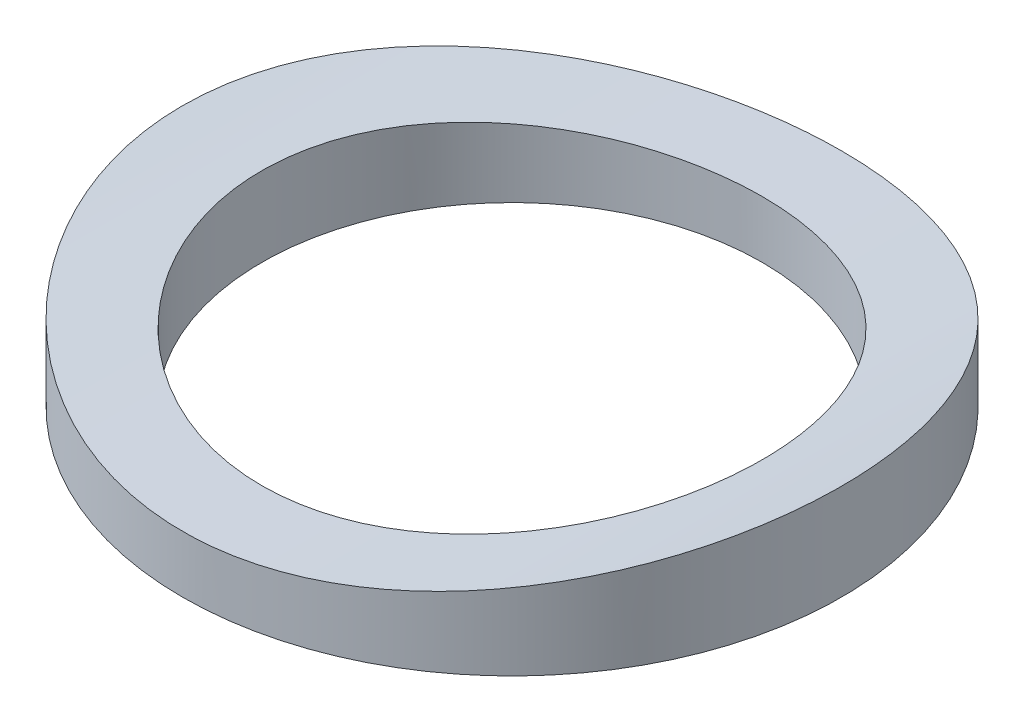
ISO-10303-21;
HEADER;
FILE_DESCRIPTION(('STEP AP214'),'2;1');
FILE_NAME('part.step','',(''),(''),'','','');
FILE_SCHEMA(('AUTOMOTIVE_DESIGN { 1 0 10303 214 1 1 1 1 }'));
ENDSEC;
DATA;
#1=APPLICATION_CONTEXT('core data for automotive mechanical design processes');
#2=APPLICATION_PROTOCOL_DEFINITION('international standard','automotive_design',2000,#1);
#3=PRODUCT_CONTEXT('',#1,'mechanical');
#4=PRODUCT('Part','Part','',(#3));
#5=PRODUCT_RELATED_PRODUCT_CATEGORY('part','',(#4));
#6=PRODUCT_DEFINITION_FORMATION('','',#4);
#7=PRODUCT_DEFINITION_CONTEXT('part definition',#1,'design');
#8=PRODUCT_DEFINITION('design','',#6,#7);
#9=PRODUCT_DEFINITION_SHAPE('','',#8);
#10=(LENGTH_UNIT() NAMED_UNIT(*) SI_UNIT(.MILLI.,.METRE.));
#11=(NAMED_UNIT(*) PLANE_ANGLE_UNIT() SI_UNIT($,.RADIAN.));
#12=(NAMED_UNIT(*) SI_UNIT($,.STERADIAN.) SOLID_ANGLE_UNIT());
#13=UNCERTAINTY_MEASURE_WITH_UNIT(LENGTH_MEASURE(1.E-05),#10,'distance_accuracy_value','');
#14=(GEOMETRIC_REPRESENTATION_CONTEXT(3) GLOBAL_UNCERTAINTY_ASSIGNED_CONTEXT((#13)) GLOBAL_UNIT_ASSIGNED_CONTEXT((#10,
#11,#12)) REPRESENTATION_CONTEXT('',''));
#15=CARTESIAN_POINT('',(0.,0.,0.));
#16=DIRECTION('',(0.,0.,1.));
#17=DIRECTION('',(1.,0.,0.));
#18=AXIS2_PLACEMENT_3D('',#15,#16,#17);
#19=CARTESIAN_POINT('',(0.,0.,0.));
#20=DIRECTION('',(0.,1.,0.));
#21=DIRECTION('',(0.,0.,1.));
#22=AXIS2_PLACEMENT_3D('',#19,#20,#21);
#23=PLANE('',#22);
#24=CARTESIAN_POINT('',(0.,0.,0.));
#25=DIRECTION('',(0.,1.,0.));
#26=DIRECTION('',(0.,0.,1.));
#27=AXIS2_PLACEMENT_3D('',#24,#25,#26);
#28=CIRCLE('',#27,10.4);
#29=CARTESIAN_POINT('',(0.,0.,10.4));
#30=VERTEX_POINT('',#29);
#31=EDGE_CURVE('E82',#30,#30,#28,.T.);
#32=ORIENTED_EDGE('',*,*,#31,.F.);
#33=EDGE_LOOP('',(#32));
#34=FACE_BOUND('',#33,.T.);
#35=CARTESIAN_POINT('',(0.,0.,0.));
#36=DIRECTION('',(0.,1.,0.));
#37=DIRECTION('',(0.,0.,1.));
#38=AXIS2_PLACEMENT_3D('',#35,#36,#37);
#39=CIRCLE('',#38,7.9);
#40=CARTESIAN_POINT('',(0.,0.,7.9));
#41=VERTEX_POINT('',#40);
#42=EDGE_CURVE('E86',#41,#41,#39,.T.);
#43=ORIENTED_EDGE('',*,*,#42,.T.);
#44=EDGE_LOOP('',(#43));
#45=FACE_BOUND('',#44,.T.);
#46=ADVANCED_FACE('F70',(#34,#45),#23,.F.);
#47=CARTESIAN_POINT('',(0.,3.2,0.));
#48=DIRECTION('',(0.,-1.,0.));
#49=DIRECTION('',(0.,0.,-1.));
#50=AXIS2_PLACEMENT_3D('',#47,#48,#49);
#51=CYLINDRICAL_SURFACE('',#50,10.4);
#52=CARTESIAN_POINT('',(0.,1.79999999999999,-10.4));
#53=CARTESIAN_POINT('',(0.287979332366271,1.79999565918138,-10.4000075384142));
#54=CARTESIAN_POINT('',(0.575872328720131,1.80280301075427,-10.3880363887862));
#55=CARTESIAN_POINT('',(1.14965018998951,1.81394450596868,-10.3402672567559));
#56=CARTESIAN_POINT('',(1.43553478254078,1.82227938512812,-10.3044661034227));
#57=CARTESIAN_POINT('',(2.0032952509663,1.84425592871867,-10.2092963026971));
#58=CARTESIAN_POINT('',(2.28516881630307,1.85790053295831,-10.149914599208));
#59=CARTESIAN_POINT('',(2.842765148361,1.89011755533941,-10.0080687635648));
#60=CARTESIAN_POINT('',(3.11848778082583,1.90869008092869,-9.92560412811102));
#61=CARTESIAN_POINT('',(3.66154120237418,1.95022910967917,-9.73835292754523));
#62=CARTESIAN_POINT('',(3.92888131867466,1.97319051161332,-9.63359226140965));
#63=CARTESIAN_POINT('',(4.45369682247072,2.02289780247291,-9.40248884021462));
#64=CARTESIAN_POINT('',(4.71117214482182,2.04964371638479,-9.27614594266192));
#65=CARTESIAN_POINT('',(5.21450899153123,2.10619488065719,-9.00282705863755));
#66=CARTESIAN_POINT('',(5.46037267742171,2.13599955831815,-8.8558549327372));
#67=CARTESIAN_POINT('',(5.93902647037211,2.19788620789578,-8.54223976409452));
#68=CARTESIAN_POINT('',(6.17181222101069,2.22996893069466,-8.37559022323182));
#69=CARTESIAN_POINT('',(6.62638723058722,2.29607978467334,-8.02093721842671));
#70=CARTESIAN_POINT('',(6.84793773282754,2.3301309882547,-7.83263196870272));
#71=CARTESIAN_POINT('',(7.27446060948033,2.39875835983832,-7.438185463944));
#72=CARTESIAN_POINT('',(7.47943281712706,2.43333453311725,-7.23204402953321));
#73=CARTESIAN_POINT('',(7.87149523559683,2.50206640972871,-6.80323323619052));
#74=CARTESIAN_POINT('',(8.05858054504711,2.53622199559074,-6.58055937656572));
#75=CARTESIAN_POINT('',(8.41347876906059,2.60313891588837,-6.12027768098893));
#76=CARTESIAN_POINT('',(8.58129839316741,2.63590073320605,-5.88267508905527));
#77=CARTESIAN_POINT('',(8.89862926609753,2.6995300099637,-5.39084003680556));
#78=CARTESIAN_POINT('',(9.04787338934574,2.73036721451727,-5.13643119523148));
#79=CARTESIAN_POINT('',(9.32435395548388,2.78876556520445,-4.61555641703929));
#80=CARTESIAN_POINT('',(9.45159015775254,2.81632667551821,-4.34909034863496));
#81=CARTESIAN_POINT('',(9.68305329513035,2.8673417967741,-3.805995177128));
#82=CARTESIAN_POINT('',(9.78728270501069,2.89079624940083,-3.52936717085185));
#83=CARTESIAN_POINT('',(9.97190217097707,2.93288280283842,-2.967910184837));
#84=CARTESIAN_POINT('',(10.0522927225158,2.95151500387107,-2.68308137567392));
#85=CARTESIAN_POINT('',(10.187352858044,2.98309498275912,-2.11241381013649));
#86=CARTESIAN_POINT('',(10.2424520787315,2.99613744121785,-1.82668195114166));
#87=CARTESIAN_POINT('',(10.3285314067545,3.01661125292242,-1.25140811250909));
#88=CARTESIAN_POINT('',(10.3595117716163,3.02404266607954,-0.961866173586625));
#89=CARTESIAN_POINT('',(10.3970850023576,3.03306468008669,-0.381149226085959));
#90=CARTESIAN_POINT('',(10.4036808840413,3.03465600322243,-0.0899744239171189));
#91=CARTESIAN_POINT('',(10.3924359926692,3.03195043355339,0.491873478725045));
#92=CARTESIAN_POINT('',(10.3745955111182,3.02765361098915,0.782546585141755));
#93=CARTESIAN_POINT('',(10.3152659146458,3.01345653384808,1.35513241263597));
#94=CARTESIAN_POINT('',(10.2742827259317,3.00367618696533,1.63710071085482));
#95=CARTESIAN_POINT('',(10.1693840755349,2.97888922489355,2.19649912619758));
#96=CARTESIAN_POINT('',(10.1054689841644,2.96388269409882,2.47392931652874));
#97=CARTESIAN_POINT('',(9.95521196810511,2.92907902534009,3.02234940016677));
#98=CARTESIAN_POINT('',(9.86886906963075,2.90928167936781,3.29333901327457));
#99=CARTESIAN_POINT('',(9.67442089262355,2.86546353603769,3.82704141556052));
#100=CARTESIAN_POINT('',(9.56631531115719,2.84144267988976,4.08975408946596));
#101=CARTESIAN_POINT('',(9.32809817362227,2.78962651025365,4.60743771486977));
#102=CARTESIAN_POINT('',(9.19780172905885,2.76179990713803,4.86232043597072));
#103=CARTESIAN_POINT('',(8.9167612256678,2.70330703863284,5.36033132237882));
#104=CARTESIAN_POINT('',(8.76600957068297,2.67263971967644,5.6034550752145));
#105=CARTESIAN_POINT('',(8.44518124145602,2.60932939812987,6.07622432254691));
#106=CARTESIAN_POINT('',(8.27510990784106,2.57668694269614,6.30587351538628));
#107=CARTESIAN_POINT('',(7.91666091796957,2.51029024305204,6.75041070118731));
#108=CARTESIAN_POINT('',(7.72827489842882,2.47653549561561,6.96529187325198));
#109=CARTESIAN_POINT('',(7.32957745168367,2.4079915176292,7.38396360933965));
#110=CARTESIAN_POINT('',(7.11883708306034,2.37319744643294,7.58734513608684));
#111=CARTESIAN_POINT('',(6.68098557800986,2.30439712907763,7.97558821653348));
#112=CARTESIAN_POINT('',(6.45388164777477,2.27039054473822,8.16045783783007));
#113=CARTESIAN_POINT('',(5.98462539066921,2.20408166514832,8.51058120208903));
#114=CARTESIAN_POINT('',(5.74246630522204,2.1717801475465,8.67582603677351));
#115=CARTESIAN_POINT('',(5.24491510623755,2.10981219430386,8.98535879701328));
#116=CARTESIAN_POINT('',(4.98952821554584,2.08014473100747,9.12965490962754));
#117=CARTESIAN_POINT('',(4.46640785389844,2.02418075053374,9.39668508976085));
#118=CARTESIAN_POINT('',(4.19864041013301,1.99789436158858,9.51935476278368));
#119=CARTESIAN_POINT('',(3.65333258769069,1.94954203892195,9.7416555960068));
#120=CARTESIAN_POINT('',(3.37579216309786,1.92747612503247,9.84128664794915));
#121=CARTESIAN_POINT('',(2.81297411548941,1.88820072806907,10.016688373507));
#122=CARTESIAN_POINT('',(2.52769754971066,1.87099058502523,10.0924622898168));
#123=CARTESIAN_POINT('',(1.9514765467999,1.84192139304554,10.21952922784));
#124=CARTESIAN_POINT('',(1.66053223119824,1.83006222950312,10.2708227738721));
#125=CARTESIAN_POINT('',(1.08177863165197,1.81224381753214,10.3476101312934));
#126=CARTESIAN_POINT('',(0.794047013382103,1.80615733391819,10.3736606178919));
#127=CARTESIAN_POINT('',(0.217351824480446,1.79959610090213,10.4017352240859));
#128=CARTESIAN_POINT('',(-0.0716117275509139,1.79912126707022,10.4037597051634));
#129=CARTESIAN_POINT('',(-0.648637889421152,1.80379643834373,10.3837663739423));
#130=CARTESIAN_POINT('',(-0.9367005629932,1.80894603608476,10.3617503028445));
#131=CARTESIAN_POINT('',(-1.5098477536148,1.82472512484065,10.2938639783747));
#132=CARTESIAN_POINT('',(-1.79493228011832,1.83535459845455,10.2479938007497));
#133=CARTESIAN_POINT('',(-2.35645381349374,1.86162739932664,10.1335176004614));
#134=CARTESIAN_POINT('',(-2.63295477941222,1.87720488954771,10.0652097418747));
#135=CARTESIAN_POINT('',(-3.17914635317738,1.91299023847337,9.90625691494718));
#136=CARTESIAN_POINT('',(-3.44883703702728,1.93319804547794,9.81561219600878));
#137=CARTESIAN_POINT('',(-3.97956426545497,1.97770073920218,9.6126881437295));
#138=CARTESIAN_POINT('',(-4.24060178955871,2.0019951614183,9.50041126898872));
#139=CARTESIAN_POINT('',(-4.75243738377748,2.05403813397539,9.25499452349283));
#140=CARTESIAN_POINT('',(-5.00323151261985,2.08178799751963,9.12184671595849));
#141=CARTESIAN_POINT('',(-5.49667386340075,2.14045714896825,8.83343124076315));
#142=CARTESIAN_POINT('',(-5.73913486844614,2.17141899774873,8.67785191143518));
#143=CARTESIAN_POINT('',(-6.21025578350327,2.23532324054324,8.34719032247744));
#144=CARTESIAN_POINT('',(-6.43890939809275,2.26826652452318,8.17209926854852));
#145=CARTESIAN_POINT('',(-6.88085386205831,2.33523805753134,7.80362940638776));
#146=CARTESIAN_POINT('',(-7.0941426741768,2.36926644957697,7.61024818084998));
#147=CARTESIAN_POINT('',(-7.5038581173647,2.43747056580088,7.20657917536616));
#148=CARTESIAN_POINT('',(-7.7002920213352,2.47164621968177,6.99629876405626));
#149=CARTESIAN_POINT('',(-8.0791997536158,2.53996794023571,6.5553682278538));
#150=CARTESIAN_POINT('',(-8.2612771203794,2.57409720260808,6.32437458515259));
#151=CARTESIAN_POINT('',(-8.60526280536219,2.64056708208159,5.84771771423889));
#152=CARTESIAN_POINT('',(-8.76717859547333,2.67290835932555,5.60205997078311));
#153=CARTESIAN_POINT('',(-9.06977816954314,2.73488203724954,5.09761167675882));
#154=CARTESIAN_POINT('',(-9.21045837785569,2.76451398140176,4.83881892429906));
#155=CARTESIAN_POINT('',(-9.46949318815249,2.82018581493467,4.30991921227868));
#156=CARTESIAN_POINT('',(-9.58784807289759,2.84622574980874,4.03981239606902));
#157=CARTESIAN_POINT('',(-9.80067024812748,2.89378717308632,3.49181162401121));
#158=CARTESIAN_POINT('',(-9.89527488936624,2.91533451383465,3.21397327539534));
#159=CARTESIAN_POINT('',(-10.0607363166277,2.95344930661,2.6509748698366));
#160=CARTESIAN_POINT('',(-10.1315931424869,2.97001676699066,2.36581482517658));
#161=CARTESIAN_POINT('',(-10.2489524852777,2.99765771293205,1.79030835838379));
#162=CARTESIAN_POINT('',(-10.2954588249026,3.00873206082197,1.49996275771759));
#163=CARTESIAN_POINT('',(-10.3637299104643,3.0250437773624,0.91621620847659));
#164=CARTESIAN_POINT('',(-10.3854951634396,3.03028126563224,0.622815322640541));
#165=CARTESIAN_POINT('',(-10.4038610955235,3.03469882527321,0.0425571172510587));
#166=CARTESIAN_POINT('',(-10.401079381199,3.03402756305689,-0.244279706331884));
#167=CARTESIAN_POINT('',(-10.3718449309817,3.02700196919927,-0.81667058491864));
#168=CARTESIAN_POINT('',(-10.3453926136157,3.0206477380402,-1.10222466251334));
#169=CARTESIAN_POINT('',(-10.2690393332232,3.00244670036276,-1.66999385504474));
#170=CARTESIAN_POINT('',(-10.2191388827936,2.99060001391442,-1.95220904283427));
#171=CARTESIAN_POINT('',(-10.0962984613982,2.9617656711183,-2.5113103661334));
#172=CARTESIAN_POINT('',(-10.0233583792828,2.94477798996897,-2.78819647592723));
#173=CARTESIAN_POINT('',(-9.85542170374624,2.90625142948378,-3.33341313633484));
#174=CARTESIAN_POINT('',(-9.76053200638674,2.88473465145563,-3.60177820399681));
#175=CARTESIAN_POINT('',(-9.54919041221849,2.83770707382971,-4.12962659256512));
#176=CARTESIAN_POINT('',(-9.43273070702798,2.81219482838369,-4.38910665665049));
#177=CARTESIAN_POINT('',(-9.17913370570421,2.75789948075519,-4.89736216004434));
#178=CARTESIAN_POINT('',(-9.04199857082408,2.72911672052498,-5.14613871472708));
#179=CARTESIAN_POINT('',(-8.74799407575789,2.66906836356969,-5.63143808319039));
#180=CARTESIAN_POINT('',(-8.59112383352388,2.63780265589392,-5.86796034860584));
#181=CARTESIAN_POINT('',(-8.25487824629631,2.57289543022093,-6.33254195017712));
#182=CARTESIAN_POINT('',(-8.07506823537357,2.53921580612675,-6.56028147702595));
#183=CARTESIAN_POINT('',(-7.69711986035087,2.47108147021079,-6.99988381227553));
#184=CARTESIAN_POINT('',(-7.49898124005546,2.43662674755986,-7.21174639867504));
#185=CARTESIAN_POINT('',(-7.08564009914733,2.36788408456537,-7.61825091744476));
#186=CARTESIAN_POINT('',(-6.87043350686923,2.33359618610174,-7.81288871716779));
#187=CARTESIAN_POINT('',(-6.42441424503635,2.26613633273489,-8.18358036990355));
#188=CARTESIAN_POINT('',(-6.1936019158554,2.23296435351617,-8.35963462802408));
#189=CARTESIAN_POINT('',(-5.71417039289369,2.16814250903856,-8.69454312494166));
#190=CARTESIAN_POINT('',(-5.46532999396404,2.13652436241962,-8.85308707825779));
#191=CARTESIAN_POINT('',(-4.95490236615415,2.07628088334665,-9.14854500240789));
#192=CARTESIAN_POINT('',(-4.69331986106679,2.04765445398871,-9.28546691037431));
#193=CARTESIAN_POINT('',(-4.15925707096074,1.99420922307476,-9.53664460000663));
#194=CARTESIAN_POINT('',(-3.88678223821928,1.96938854586358,-9.65091155529836));
#195=CARTESIAN_POINT('',(-3.33285768881133,1.924252769826,-9.85592825299427));
#196=CARTESIAN_POINT('',(-3.05140946620949,1.90393692538202,-9.94668188762621));
#197=CARTESIAN_POINT('',(-2.31715512054049,1.85816151470265,-10.1492716775302));
#198=CARTESIAN_POINT('',(-1.85901959684866,1.83647887521881,-10.2431442252629));
#199=CARTESIAN_POINT('',(-0.933846754474663,1.80740204703461,-10.3685004822282));
#200=CARTESIAN_POINT('',(-0.466809949424707,1.80000703639839,-10.3999877803496));
#201=CARTESIAN_POINT('',(0.,1.79999999999999,-10.4));
#202=B_SPLINE_CURVE_WITH_KNOTS('',3,(#52,#53,#54,#55,#56,#57,#58,#59,#60,#61,#62,#63,#64,#65,
#66,#67,#68,#69,#70,#71,#72,#73,#74,#75,#76,#77,#78,#79,#80,#81,#82,#83,#84,#85,#86,#87,#88,#89,
#90,#91,#92,#93,#94,#95,#96,#97,#98,#99,#100,#101,#102,#103,#104,#105,#106,#107,#108,#109,#110,
#111,#112,#113,#114,#115,#116,#117,#118,#119,#120,#121,#122,#123,#124,#125,#126,#127,#128,#129,
#130,#131,#132,#133,#134,#135,#136,#137,#138,#139,#140,#141,#142,#143,#144,#145,#146,#147,#148,
#149,#150,#151,#152,#153,#154,#155,#156,#157,#158,#159,#160,#161,#162,#163,#164,#165,#166,#167,
#168,#169,#170,#171,#172,#173,#174,#175,#176,#177,#178,#179,#180,#181,#182,#183,#184,#185,#186,
#187,#188,#189,#190,#191,#192,#193,#194,#195,#196,#197,#198,#199,#200,#201),.UNSPECIFIED.,.T.,
.F.,(4,2,2,2,2,2,2,2,2,2,2,2,2,2,2,2,2,2,2,2,2,2,2,2,2,2,2,2,2,2,2,2,2,2,2,2,2,2,2,2,2,2,2,2,2,
2,2,2,2,2,2,2,2,2,2,2,2,2,2,2,2,2,2,2,2,2,2,2,2,2,2,2,2,2,4),(0.,0.863527152084144,
1.72716923207354,2.59129016227944,3.45542993522407,4.31857135274867,5.18171846924785,
6.04470427049423,6.9079758588922,7.78521014593497,8.66245325622826,9.53993606407321,
10.4171123432231,11.3057211250047,12.1943396216813,13.0828624857172,13.9713668819272,
14.844161795604,15.7169473899835,16.589625037085,17.4622922739776,18.3165820932819,
19.1708581178458,20.0251712401402,20.8794962551769,21.7413226570026,22.6034699833044,
23.4653795595879,24.3276845867734,25.2114472626096,26.0948230977419,26.9785984032263,
27.8620273815454,28.7480439763255,29.6340647343921,30.5199650112731,31.405846313159,
32.2717142467649,33.137569152981,34.0033613515147,34.8691508008006,35.7238715472671,
36.5785827507723,37.4331968694207,38.2881367719275,39.1563659170184,40.0249879841833,
40.8937250129377,41.7620852760745,42.6493286855485,43.5362422972329,44.4233050811988,
45.3103566293378,46.1921535142822,47.0739489200229,47.9556058544037,48.8372447199659,
49.6967658736199,50.5562718301284,51.4157589979464,52.2752503122294,53.1306408366126,
53.9863416212828,54.8419530194007,55.6976026721158,56.5729341094611,57.4482777839509,
58.3238309085981,59.1993649428757,60.0885233696095,60.9773546368969,61.8657464280947,
62.7539910671464,64.1538354745085,65.5535993495027),.UNSPECIFIED.);
#203=CARTESIAN_POINT('',(0.,1.79999999999999,-10.4));
#204=VERTEX_POINT('',#203);
#205=EDGE_CURVE('E90',#204,#204,#202,.T.);
#206=ORIENTED_EDGE('',*,*,#205,.T.);
#207=EDGE_LOOP('',(#206));
#208=FACE_BOUND('',#207,.T.);
#209=ORIENTED_EDGE('',*,*,#31,.T.);
#210=EDGE_LOOP('',(#209));
#211=FACE_BOUND('',#210,.T.);
#212=ADVANCED_FACE('F72',(#208,#211),#51,.T.);
#213=CARTESIAN_POINT('',(0.,3.2,0.));
#214=DIRECTION('',(0.,-1.,0.));
#215=DIRECTION('',(0.,0.,-1.));
#216=AXIS2_PLACEMENT_3D('',#213,#214,#215);
#217=CYLINDRICAL_SURFACE('',#216,7.9);
#218=CARTESIAN_POINT('',(0.,1.79999999999999,-7.9));
#219=CARTESIAN_POINT('',(0.220090972386604,1.79999830488031,-7.90000368747465));
#220=CARTESIAN_POINT('',(0.440133240673127,1.80163761550237,-7.89079981879664));
#221=CARTESIAN_POINT('',(0.87870139620927,1.80814540206575,-7.85406204762625));
#222=CARTESIAN_POINT('',(1.0972269891268,1.81301448801038,-7.8265246825076));
#223=CARTESIAN_POINT('',(1.53125050460558,1.82585167861889,-7.75330542228435));
#224=CARTESIAN_POINT('',(1.74674654589464,1.83382162777519,-7.70761272746576));
#225=CARTESIAN_POINT('',(2.17313412432505,1.85264035274928,-7.59841665757685));
#226=CARTESIAN_POINT('',(2.38402394032743,1.86349018538687,-7.53490674370193));
#227=CARTESIAN_POINT('',(2.79937517142281,1.8877499714517,-7.39065434186009));
#228=CARTESIAN_POINT('',(3.0038442686385,1.90115671823569,-7.30993342352927));
#229=CARTESIAN_POINT('',(3.40529315683082,1.93017374470839,-7.13177552895993));
#230=CARTESIAN_POINT('',(3.60227011739876,1.94578484687499,-7.03433231044606));
#231=CARTESIAN_POINT('',(3.98721096390278,1.97876834687024,-6.82350940207311));
#232=CARTESIAN_POINT('',(4.17517952084635,1.99613981704105,-6.71013809376287));
#233=CARTESIAN_POINT('',(4.54103282643752,2.03218312001022,-6.46816385784793));
#234=CARTESIAN_POINT('',(4.71891293612007,2.05085554237007,-6.33955400574555));
#235=CARTESIAN_POINT('',(5.06497731489475,2.08916768941169,-6.06671441205502));
#236=CARTESIAN_POINT('',(5.23305100636111,2.10881503042277,-5.92234546693748));
#237=CARTESIAN_POINT('',(5.55639670641463,2.14835059729929,-5.62009006730953));
#238=CARTESIAN_POINT('',(5.7116743390674,2.16823871288469,-5.46220961418701));
#239=CARTESIAN_POINT('',(6.00852000022776,2.20771777577246,-5.13387667554005));
#240=CARTESIAN_POINT('',(6.15008159454076,2.2273085800067,-4.96341835515129));
#241=CARTESIAN_POINT('',(6.41838563186696,2.26562561514617,-4.61121644648293));
#242=CARTESIAN_POINT('',(6.54513326095857,2.28435214721846,-4.42947684188017));
#243=CARTESIAN_POINT('',(6.78383956496923,2.32054853393656,-4.05453671166029));
#244=CARTESIAN_POINT('',(6.89568407565506,2.33800826742313,-3.86126249736057));
#245=CARTESIAN_POINT('',(7.10267097772037,2.37101237933784,-3.46581439589421));
#246=CARTESIAN_POINT('',(7.19781365616177,2.38655679068411,-3.26364066176234));
#247=CARTESIAN_POINT('',(7.37068291240928,2.41527385544745,-2.85182397569775));
#248=CARTESIAN_POINT('',(7.44841015972296,2.42844660003552,-2.64218131125497));
#249=CARTESIAN_POINT('',(7.5858532604685,2.45202975696705,-2.21692595370894));
#250=CARTESIAN_POINT('',(7.64556967912872,2.46244025599599,-2.00131344818729));
#251=CARTESIAN_POINT('',(7.74600714519215,2.48009653793257,-1.56791169062879));
#252=CARTESIAN_POINT('',(7.78691641663515,2.48737363145569,-1.35016732713003));
#253=CARTESIAN_POINT('',(7.85030063673532,2.4986992321694,-0.912009242721347));
#254=CARTESIAN_POINT('',(7.87278238480375,2.50274893019324,-0.691596536870306));
#255=CARTESIAN_POINT('',(7.89915937367577,2.50750393811516,-0.249601193568087));
#256=CARTESIAN_POINT('',(7.90305255725259,2.50820887784334,-0.0280184293412061));
#257=CARTESIAN_POINT('',(7.89221560603704,2.50625229629259,0.414675447613178));
#258=CARTESIAN_POINT('',(7.87748559181829,2.50359079680926,0.635786563385028));
#259=CARTESIAN_POINT('',(7.82980791185655,2.49503246565615,1.07328856054668));
#260=CARTESIAN_POINT('',(7.79708053481945,2.48917476230936,1.28970425864998));
#261=CARTESIAN_POINT('',(7.71379940103649,2.47441793410014,1.71905023800619));
#262=CARTESIAN_POINT('',(7.66323944331096,2.46551775129989,1.93197927984687));
#263=CARTESIAN_POINT('',(7.54469912201478,2.44493604065583,2.35271494475181));
#264=CARTESIAN_POINT('',(7.47672458531996,2.43325544322447,2.56052325575506));
#265=CARTESIAN_POINT('',(7.32382379831228,2.40743947427805,2.9697360104075));
#266=CARTESIAN_POINT('',(7.23889123381203,2.3933031886625,3.17113803624764));
#267=CARTESIAN_POINT('',(7.05223629304302,2.36290116638256,3.56708689530547));
#268=CARTESIAN_POINT('',(6.95043132429299,2.34662504025133,3.76159399032513));
#269=CARTESIAN_POINT('',(6.73102437282748,2.31245186573063,4.14142885001042));
#270=CARTESIAN_POINT('',(6.61341658880402,2.29455422286239,4.32675320927798));
#271=CARTESIAN_POINT('',(6.36329007278428,2.25764828145482,4.68685229701395));
#272=CARTESIAN_POINT('',(6.23077563194602,2.2386403032997,4.86163003937588));
#273=CARTESIAN_POINT('',(5.95166360133039,2.20002780620183,5.19959127489843));
#274=CARTESIAN_POINT('',(5.8050607866839,2.18042306779824,5.36277042722735));
#275=CARTESIAN_POINT('',(5.49668815714169,2.14089200699854,5.67853746201346));
#276=CARTESIAN_POINT('',(5.3347371286102,2.1209649768815,5.83094834239195));
#277=CARTESIAN_POINT('',(4.99847182771955,2.08161267871254,6.12165776135053));
#278=CARTESIAN_POINT('',(4.82415322453474,2.06218758970908,6.25995131462778));
#279=CARTESIAN_POINT('',(4.4644260305148,2.02439546755088,6.52137472863409));
#280=CARTESIAN_POINT('',(4.27901916000445,2.00602827112957,6.64450693259843));
#281=CARTESIAN_POINT('',(3.89836989750811,1.97086565929357,6.87475000711871));
#282=CARTESIAN_POINT('',(3.70312759667095,1.95407022931682,6.98186102611283));
#283=CARTESIAN_POINT('',(3.30391809190376,1.92250560549343,7.1793998920052));
#284=CARTESIAN_POINT('',(3.09994045827421,1.90773892768469,7.26980707001499));
#285=CARTESIAN_POINT('',(2.68499611252227,1.88068060571877,7.43306710063705));
#286=CARTESIAN_POINT('',(2.47403178568052,1.86838812680176,7.50592587547008));
#287=CARTESIAN_POINT('',(2.04653816031122,1.8466218839255,7.63357369895932));
#288=CARTESIAN_POINT('',(1.83000829173702,1.83714840996071,7.6883608886325));
#289=CARTESIAN_POINT('',(1.39298392733115,1.82129419060887,7.7794224417598));
#290=CARTESIAN_POINT('',(1.172489561962,1.81491334364302,7.8156974132586));
#291=CARTESIAN_POINT('',(0.732101853536946,1.80549090906096,7.86908949413132));
#292=CARTESIAN_POINT('',(0.512239522133868,1.80240603679846,7.88645499330823));
#293=CARTESIAN_POINT('',(0.0718151898810421,1.79951254355836,7.90274638274106));
#294=CARTESIAN_POINT('',(-0.148746794775871,1.79970384730185,7.90167269668656));
#295=CARTESIAN_POINT('',(-0.589011817098494,1.80335744144198,7.88109360810535));
#296=CARTESIAN_POINT('',(-0.808714732246201,1.80682018245919,7.861585666372));
#297=CARTESIAN_POINT('',(-1.24557358743286,1.8169180852631,7.80429763159287));
#298=CARTESIAN_POINT('',(-1.46273038149315,1.82355215021059,7.76652385594577));
#299=CARTESIAN_POINT('',(-1.89156169945871,1.83975089012806,7.67331833399149));
#300=CARTESIAN_POINT('',(-2.10326342019485,1.84929537942454,7.61800811237967));
#301=CARTESIAN_POINT('',(-2.52121947283837,1.87106642593082,7.4900744255225));
#302=CARTESIAN_POINT('',(-2.72747396248152,1.88329290538247,7.41745146221505));
#303=CARTESIAN_POINT('',(-3.13313755343377,1.91009385358406,7.25542258004632));
#304=CARTESIAN_POINT('',(-3.33254621294365,1.92466847352822,7.16601558041785));
#305=CARTESIAN_POINT('',(-3.72315273385119,1.95576758952706,6.97106730015548));
#306=CARTESIAN_POINT('',(-3.91435060525698,1.97229208320495,6.86552603918837));
#307=CARTESIAN_POINT('',(-4.28914535624275,2.00701735412991,6.63790533470242));
#308=CARTESIAN_POINT('',(-4.472645797834,2.02523339536156,6.5156694159244));
#309=CARTESIAN_POINT('',(-4.8286613414242,2.06268776072783,6.25639719471055));
#310=CARTESIAN_POINT('',(-5.00118029496912,2.08192572205215,6.11936612736144));
#311=CARTESIAN_POINT('',(-5.33421499225609,2.12090782096466,5.83134951084733));
#312=CARTESIAN_POINT('',(-5.49472561350611,2.14065216979838,5.68035806720649));
#313=CARTESIAN_POINT('',(-5.80252777199113,2.18008685607053,5.36554913631929));
#314=CARTESIAN_POINT('',(-5.94982373981731,2.19977720944978,5.2017359826705));
#315=CARTESIAN_POINT('',(-6.23194933485787,2.23879872853531,4.8602922310896));
#316=CARTESIAN_POINT('',(-6.3666071521605,2.2581226963847,4.68251879412574));
#317=CARTESIAN_POINT('',(-6.62046490441871,2.29560984786625,4.31614551771672));
#318=CARTESIAN_POINT('',(-6.7396650593687,2.31377304801665,4.12754583240652));
#319=CARTESIAN_POINT('',(-6.96174954053623,2.34841483126448,3.74082362776208));
#320=CARTESIAN_POINT('',(-7.06463387802704,2.36489341552589,3.54270111500767));
#321=CARTESIAN_POINT('',(-7.25332260700148,2.39568487391325,3.13832590880599));
#322=CARTESIAN_POINT('',(-7.33912749579906,2.40999781109492,2.93207345229341));
#323=CARTESIAN_POINT('',(-7.4926742997873,2.43597971664409,2.51381090600031));
#324=CARTESIAN_POINT('',(-7.56049322674277,2.44765992438326,2.30182979154903));
#325=CARTESIAN_POINT('',(-7.67801273533273,2.46810669969799,1.87284816623749));
#326=CARTESIAN_POINT('',(-7.72771999389338,2.47687434089531,1.65584953653874));
#327=CARTESIAN_POINT('',(-7.80866381234023,2.4912413070239,1.21830742261626));
#328=CARTESIAN_POINT('',(-7.83989853448414,2.49684031672112,0.99776358793858));
#329=CARTESIAN_POINT('',(-7.88363940751399,2.50470052776847,0.55476808213302));
#330=CARTESIAN_POINT('',(-7.89614576165057,2.50696176534196,0.33231643173617));
#331=CARTESIAN_POINT('',(-7.90228539713771,2.50807053745188,-0.109643617307142));
#332=CARTESIAN_POINT('',(-7.89618825763984,2.50696683281312,-0.329148196226936));
#333=CARTESIAN_POINT('',(-7.86574767856084,2.50148285774542,-0.766924588092765));
#334=CARTESIAN_POINT('',(-7.84139788163034,2.49710144570126,-0.985195944817177));
#335=CARTESIAN_POINT('',(-7.77464117552095,2.48518992246413,-1.41882655239891));
#336=CARTESIAN_POINT('',(-7.73223785827551,2.47766043761795,-1.63418637374682));
#337=CARTESIAN_POINT('',(-7.62969993290405,2.45967133377708,-2.06052163907083));
#338=CARTESIAN_POINT('',(-7.56956489989315,2.44921164456954,-2.27149697785689));
#339=CARTESIAN_POINT('',(-7.43212448513857,2.42568170430074,-2.68726453149062));
#340=CARTESIAN_POINT('',(-7.35484572204046,2.41261550344134,-2.89206577874098));
#341=CARTESIAN_POINT('',(-7.18363218344633,2.38423369686945,-3.2944243563611));
#342=CARTESIAN_POINT('',(-7.08969709525379,2.36891804892802,-3.49198155065101));
#343=CARTESIAN_POINT('',(-6.88585887327828,2.33647029627615,-3.87848894798418));
#344=CARTESIAN_POINT('',(-6.77595774589017,2.31933841987761,-4.0674402285886));
#345=CARTESIAN_POINT('',(-6.54091000277012,2.28372742786717,-4.43556120446689));
#346=CARTESIAN_POINT('',(-6.41575838772795,2.26524787126938,-4.61472766412368));
#347=CARTESIAN_POINT('',(-6.14933053220468,2.2272039102374,-4.96434060308292));
#348=CARTESIAN_POINT('',(-6.00786171396244,2.20762833420378,-5.13463914151903));
#349=CARTESIAN_POINT('',(-5.71115536728931,2.16817159194853,-5.4627491522704));
#350=CARTESIAN_POINT('',(-5.55591773537546,2.14829042343107,-5.62056053071843));
#351=CARTESIAN_POINT('',(-5.23266841425798,2.10876986524388,-5.92268030101324));
#352=CARTESIAN_POINT('',(-5.06465159936928,2.08913057630007,-6.06698322234544));
#353=CARTESIAN_POINT('',(-4.71710247078525,2.05065616387881,-6.34096936124379));
#354=CARTESIAN_POINT('',(-4.53757419426642,2.03182076228899,-6.47065766076795));
#355=CARTESIAN_POINT('',(-4.16662472679555,1.99531942525169,-6.7155823083222));
#356=CARTESIAN_POINT('',(-3.97511669926028,1.97766457609221,-6.83068885084702));
#357=CARTESIAN_POINT('',(-3.58298864616234,1.94420582300013,-7.04429019750187));
#358=CARTESIAN_POINT('',(-3.38237200906244,1.92840123846081,-7.14279111579673));
#359=CARTESIAN_POINT('',(-2.97350257996528,1.89909536548855,-7.3224381684411));
#360=CARTESIAN_POINT('',(-2.7652549874788,1.88559254289636,-7.40359587152884));
#361=CARTESIAN_POINT('',(-2.34256082971581,1.86126544194419,-7.54799994864175));
#362=CARTESIAN_POINT('',(-2.12811556270938,1.85044060708473,-7.61125004435414));
#363=CARTESIAN_POINT('',(-1.59932531260972,1.82768640324393,-7.74308939358502));
#364=CARTESIAN_POINT('',(-1.28240861202181,1.81735414720368,-7.80185783244296));
#365=CARTESIAN_POINT('',(-0.64362650596281,1.80351225706028,-7.88031002549666));
#366=CARTESIAN_POINT('',(-0.321761205654406,1.8000024781741,-7.8999946091097));
#367=CARTESIAN_POINT('',(0.,1.79999999999999,-7.9));
#368=B_SPLINE_CURVE_WITH_KNOTS('',3,(#218,#219,#220,#221,#222,#223,#224,#225,#226,#227,#228,
#229,#230,#231,#232,#233,#234,#235,#236,#237,#238,#239,#240,#241,#242,#243,#244,#245,#246,#247,
#248,#249,#250,#251,#252,#253,#254,#255,#256,#257,#258,#259,#260,#261,#262,#263,#264,#265,#266,
#267,#268,#269,#270,#271,#272,#273,#274,#275,#276,#277,#278,#279,#280,#281,#282,#283,#284,#285,
#286,#287,#288,#289,#290,#291,#292,#293,#294,#295,#296,#297,#298,#299,#300,#301,#302,#303,#304,
#305,#306,#307,#308,#309,#310,#311,#312,#313,#314,#315,#316,#317,#318,#319,#320,#321,#322,#323,
#324,#325,#326,#327,#328,#329,#330,#331,#332,#333,#334,#335,#336,#337,#338,#339,#340,#341,#342,
#343,#344,#345,#346,#347,#348,#349,#350,#351,#352,#353,#354,#355,#356,#357,#358,#359,#360,#361,
#362,#363,#364,#365,#366,#367),.UNSPECIFIED.,.T.,.F.,(4,2,2,2,2,2,2,2,2,2,2,2,2,2,2,2,2,2,2,2,2,
2,2,2,2,2,2,2,2,2,2,2,2,2,2,2,2,2,2,2,2,2,2,2,2,2,2,2,2,2,2,2,2,2,2,2,2,2,2,2,2,2,2,2,2,2,2,2,2,
2,2,2,2,2,4),(0.,0.659990732034758,1.32010615113099,1.98061482975174,2.64136622861773,
3.30129435978857,3.96146937383894,4.62129828814865,5.28142819144394,5.9479508698033,
6.61417902113323,7.28071820219495,7.94702333758315,8.61817049039792,9.28930610677448,
9.96041591801923,10.6315046658374,11.2957224784156,11.9596950965843,12.6237411959832,
13.2877829961185,13.943872179263,14.6001897316703,15.256287967976,15.9126309543679,
16.5722872338496,17.2321863420998,17.891895969928,18.5518512114353,19.2209036344063,
19.8901915108599,20.559375816535,21.228553921754,21.8985545844822,22.5683288181148,
23.238171928434,23.9079930359467,24.5689052680825,25.2298023140133,25.8907904077659,
26.5515500563281,27.2078273087873,27.8640855365084,28.520386036886,29.1766857372754,
29.8396234447878,30.5023273437194,31.1653123445388,31.8280742233766,32.498830772437,
33.1695777742009,33.8403243125165,34.5110513173896,35.1788582787008,35.8464188010943,
36.5140457246524,37.1816654027002,37.8396569242322,38.4978777289124,39.1559676349509,
39.8140733113282,40.471164227395,41.1282674806256,41.785288229363,42.4425249404882,
43.108516170507,43.774512406373,44.4407771941505,45.1068095813614,45.7784069266927,
46.4497564482809,47.1206567406446,47.7914174991836,48.7563090532643,49.7211801306987),.UNSPECIFIED.);
#369=CARTESIAN_POINT('',(0.,1.79999999999999,-7.9));
#370=VERTEX_POINT('',#369);
#371=EDGE_CURVE('E44',#370,#370,#368,.T.);
#372=ORIENTED_EDGE('',*,*,#371,.F.);
#373=EDGE_LOOP('',(#372));
#374=FACE_BOUND('',#373,.T.);
#375=ORIENTED_EDGE('',*,*,#42,.F.);
#376=EDGE_LOOP('',(#375));
#377=FACE_BOUND('',#376,.T.);
#378=ADVANCED_FACE('F99',(#374,#377),#217,.F.);
#379=CARTESIAN_POINT('',(0.,46.25,-15.));
#380=DIRECTION('',(0.,0.,1.));
#381=DIRECTION('',(1.,0.,0.));
#382=AXIS2_PLACEMENT_3D('',#379,#380,#381);
#383=CYLINDRICAL_SURFACE('',#382,44.45);
#384=ORIENTED_EDGE('',*,*,#371,.T.);
#385=EDGE_LOOP('',(#384));
#386=FACE_BOUND('',#385,.T.);
#387=ORIENTED_EDGE('',*,*,#205,.F.);
#388=EDGE_LOOP('',(#387));
#389=FACE_BOUND('',#388,.T.);
#390=ADVANCED_FACE('F96',(#386,#389),#383,.F.);
#391=CLOSED_SHELL('',(#46,#212,#378,#390));
#392=MANIFOLD_SOLID_BREP('B6',#391);
#393=ADVANCED_BREP_SHAPE_REPRESENTATION('',(#18,#392),#14);
#394=SHAPE_DEFINITION_REPRESENTATION(#9,#393);
ENDSEC;
END-ISO-10303-21;
